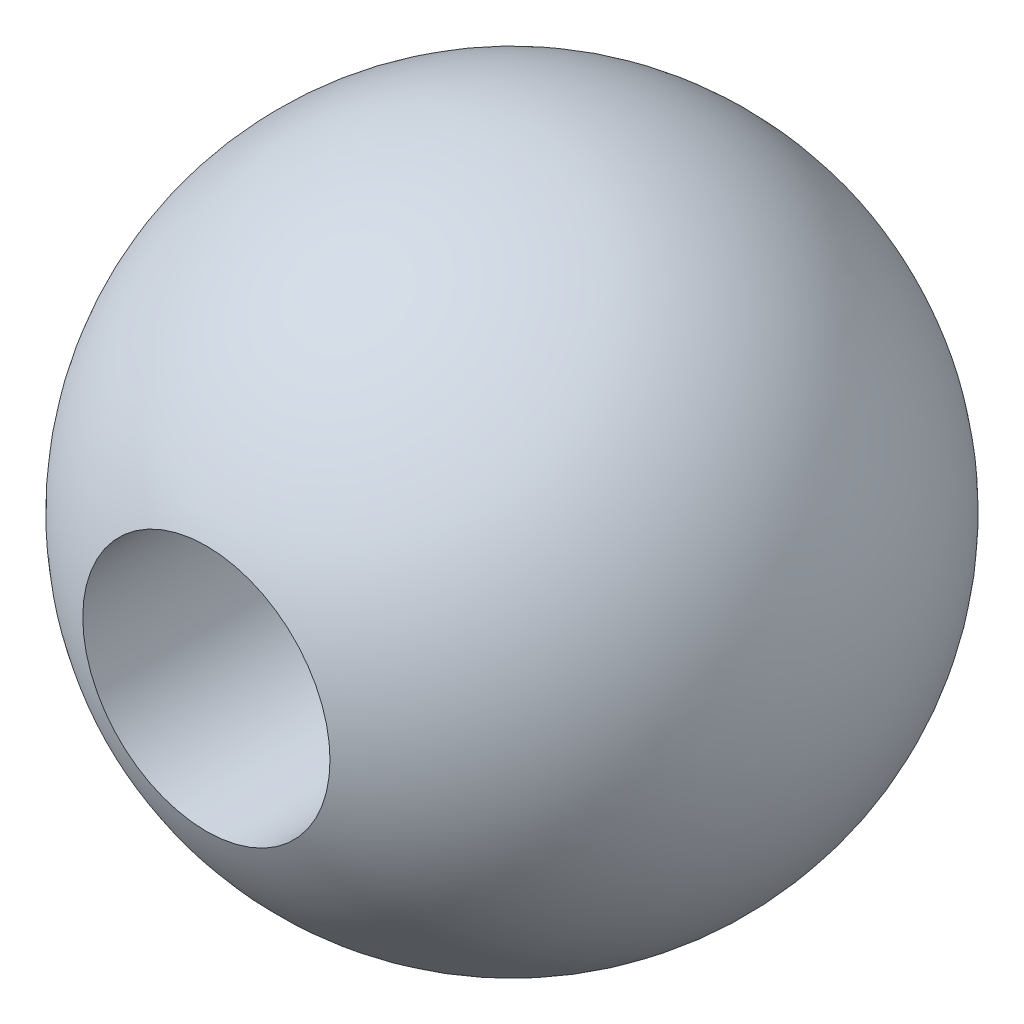
ISO-10303-21;
HEADER;
FILE_DESCRIPTION(('STEP AP214'),'2;1');
FILE_NAME('part.step','',(''),(''),'','','');
FILE_SCHEMA(('AUTOMOTIVE_DESIGN { 1 0 10303 214 1 1 1 1 }'));
ENDSEC;
DATA;
#1=APPLICATION_CONTEXT('core data for automotive mechanical design processes');
#2=APPLICATION_PROTOCOL_DEFINITION('international standard','automotive_design',2000,#1);
#3=PRODUCT_CONTEXT('',#1,'mechanical');
#4=PRODUCT('Part','Part','',(#3));
#5=PRODUCT_RELATED_PRODUCT_CATEGORY('part','',(#4));
#6=PRODUCT_DEFINITION_FORMATION('','',#4);
#7=PRODUCT_DEFINITION_CONTEXT('part definition',#1,'design');
#8=PRODUCT_DEFINITION('design','',#6,#7);
#9=PRODUCT_DEFINITION_SHAPE('','',#8);
#10=(LENGTH_UNIT() NAMED_UNIT(*) SI_UNIT(.MILLI.,.METRE.));
#11=(NAMED_UNIT(*) PLANE_ANGLE_UNIT() SI_UNIT($,.RADIAN.));
#12=(NAMED_UNIT(*) SI_UNIT($,.STERADIAN.) SOLID_ANGLE_UNIT());
#13=UNCERTAINTY_MEASURE_WITH_UNIT(LENGTH_MEASURE(1.E-05),#10,'distance_accuracy_value','');
#14=(GEOMETRIC_REPRESENTATION_CONTEXT(3) GLOBAL_UNCERTAINTY_ASSIGNED_CONTEXT((#13)) GLOBAL_UNIT_ASSIGNED_CONTEXT((#10,
#11,#12)) REPRESENTATION_CONTEXT('',''));
#15=CARTESIAN_POINT('',(0.,0.,0.));
#16=DIRECTION('',(0.,0.,1.));
#17=DIRECTION('',(1.,0.,0.));
#18=AXIS2_PLACEMENT_3D('',#15,#16,#17);
#19=CARTESIAN_POINT('',(0.,0.,0.));
#20=DIRECTION('',(0.,1.,0.));
#21=DIRECTION('',(1.,0.,0.));
#22=AXIS2_PLACEMENT_3D('',#19,#20,#21);
#23=SPHERICAL_SURFACE('',#22,25.4);
#24=CARTESIAN_POINT('',(0.,0.,0.));
#25=DIRECTION('',(0.,0.,-1.));
#26=DIRECTION('',(-1.,0.,0.));
#27=AXIS2_PLACEMENT_3D('',#24,#25,#26);
#28=SPHERICAL_SURFACE('',#27,25.4);
#29=CARTESIAN_POINT('',(0.,0.,23.5464301965287));
#30=DIRECTION('',(0.,0.,-1.));
#31=DIRECTION('',(-1.,0.,0.));
#32=AXIS2_PLACEMENT_3D('',#29,#30,#31);
#33=CIRCLE('',#32,9.525);
#34=CARTESIAN_POINT('',(9.525,0.,23.5464301965287));
#35=VERTEX_POINT('',#34);
#36=EDGE_CURVE('E10',#35,#35,#33,.T.);
#37=ORIENTED_EDGE('',*,*,#36,.T.);
#38=EDGE_LOOP('',(#37));
#39=FACE_BOUND('',#38,.T.);
#40=ADVANCED_FACE('F31',(#39),#28,.T.);
#41=CARTESIAN_POINT('',(0.,0.,6.35));
#42=DIRECTION('',(0.,0.,1.));
#43=DIRECTION('',(1.,0.,0.));
#44=AXIS2_PLACEMENT_3D('',#41,#42,#43);
#45=CYLINDRICAL_SURFACE('',#44,9.525);
#46=CARTESIAN_POINT('',(0.,0.,6.35));
#47=DIRECTION('',(0.,0.,1.));
#48=DIRECTION('',(1.,0.,0.));
#49=AXIS2_PLACEMENT_3D('',#46,#47,#48);
#50=CIRCLE('',#49,9.525);
#51=CARTESIAN_POINT('',(9.525,0.,6.35));
#52=VERTEX_POINT('',#51);
#53=EDGE_CURVE('E37',#52,#52,#50,.T.);
#54=CARTESIAN_POINT('',(9.525,0.,6.35));
#55=CARTESIAN_POINT('',(9.525,0.,6.52912948121384));
#56=CARTESIAN_POINT('',(9.525,0.,6.70825896242768));
#57=CARTESIAN_POINT('',(9.525,0.,7.06651792485536));
#58=CARTESIAN_POINT('',(9.525,0.,7.2456474060692));
#59=CARTESIAN_POINT('',(9.525,0.,7.60390636849688));
#60=CARTESIAN_POINT('',(9.525,0.,7.78303584971072));
#61=CARTESIAN_POINT('',(9.525,0.,8.14129481213841));
#62=CARTESIAN_POINT('',(9.525,0.,8.32042429335225));
#63=CARTESIAN_POINT('',(9.525,0.,8.67868325577993));
#64=CARTESIAN_POINT('',(9.525,0.,8.85781273699377));
#65=CARTESIAN_POINT('',(9.525,0.,9.21607169942145));
#66=CARTESIAN_POINT('',(9.525,0.,9.39520118063529));
#67=CARTESIAN_POINT('',(9.525,0.,9.75346014306298));
#68=CARTESIAN_POINT('',(9.525,0.,9.93258962427682));
#69=CARTESIAN_POINT('',(9.525,0.,10.2908485867045));
#70=CARTESIAN_POINT('',(9.525,0.,10.4699780679183));
#71=CARTESIAN_POINT('',(9.525,0.,10.828237030346));
#72=CARTESIAN_POINT('',(9.525,0.,11.0073665115599));
#73=CARTESIAN_POINT('',(9.525,0.,11.3656254739875));
#74=CARTESIAN_POINT('',(9.525,0.,11.5447549552014));
#75=CARTESIAN_POINT('',(9.525,0.,11.9030139176291));
#76=CARTESIAN_POINT('',(9.525,0.,12.0821433988429));
#77=CARTESIAN_POINT('',(9.525,0.,12.4404023612706));
#78=CARTESIAN_POINT('',(9.525,0.,12.6195318424844));
#79=CARTESIAN_POINT('',(9.525,0.,12.9777908049121));
#80=CARTESIAN_POINT('',(9.525,0.,13.156920286126));
#81=CARTESIAN_POINT('',(9.525,0.,13.5151792485536));
#82=CARTESIAN_POINT('',(9.525,0.,13.6943087297675));
#83=CARTESIAN_POINT('',(9.525,0.,14.0525676921952));
#84=CARTESIAN_POINT('',(9.525,0.,14.231697173409));
#85=CARTESIAN_POINT('',(9.525,0.,14.5899561358367));
#86=CARTESIAN_POINT('',(9.525,0.,14.7690856170505));
#87=CARTESIAN_POINT('',(9.525,0.,15.1273445794782));
#88=CARTESIAN_POINT('',(9.525,0.,15.306474060692));
#89=CARTESIAN_POINT('',(9.525,0.,15.6647330231197));
#90=CARTESIAN_POINT('',(9.525,0.,15.8438625043336));
#91=CARTESIAN_POINT('',(9.525,0.,16.2021214667612));
#92=CARTESIAN_POINT('',(9.525,0.,16.3812509479751));
#93=CARTESIAN_POINT('',(9.525,0.,16.7395099104028));
#94=CARTESIAN_POINT('',(9.525,0.,16.9186393916166));
#95=CARTESIAN_POINT('',(9.525,0.,17.2768983540443));
#96=CARTESIAN_POINT('',(9.525,0.,17.4560278352581));
#97=CARTESIAN_POINT('',(9.525,0.,17.8142867976858));
#98=CARTESIAN_POINT('',(9.525,0.,17.9934162788997));
#99=CARTESIAN_POINT('',(9.525,0.,18.3516752413273));
#100=CARTESIAN_POINT('',(9.525,0.,18.5308047225412));
#101=CARTESIAN_POINT('',(9.525,0.,18.8890636849689));
#102=CARTESIAN_POINT('',(9.525,0.,19.0681931661827));
#103=CARTESIAN_POINT('',(9.525,0.,19.4264521286104));
#104=CARTESIAN_POINT('',(9.525,0.,19.6055816098242));
#105=CARTESIAN_POINT('',(9.525,0.,19.9638405722519));
#106=CARTESIAN_POINT('',(9.525,0.,20.1429700534657));
#107=CARTESIAN_POINT('',(9.525,0.,20.5012290158934));
#108=CARTESIAN_POINT('',(9.525,0.,20.6803584971073));
#109=CARTESIAN_POINT('',(9.525,0.,21.038617459535));
#110=CARTESIAN_POINT('',(9.525,0.,21.2177469407488));
#111=CARTESIAN_POINT('',(9.525,0.,21.5760059031765));
#112=CARTESIAN_POINT('',(9.525,0.,21.7551353843903));
#113=CARTESIAN_POINT('',(9.525,0.,22.113394346818));
#114=CARTESIAN_POINT('',(9.525,0.,22.2925238280318));
#115=CARTESIAN_POINT('',(9.525,0.,22.6507827904595));
#116=CARTESIAN_POINT('',(9.525,0.,22.8299122716734));
#117=CARTESIAN_POINT('',(9.525,0.,23.188171234101));
#118=CARTESIAN_POINT('',(9.525,0.,23.3673007153149));
#119=CARTESIAN_POINT('',(9.525,0.,23.5464301965287));
#120=B_SPLINE_CURVE_WITH_KNOTS('',3,(#54,#55,#56,#57,#58,#59,#60,#61,#62,#63,#64,#65,#66,#67,
#68,#69,#70,#71,#72,#73,#74,#75,#76,#77,#78,#79,#80,#81,#82,#83,#84,#85,#86,#87,#88,#89,#90,#91,
#92,#93,#94,#95,#96,#97,#98,#99,#100,#101,#102,#103,#104,#105,#106,#107,#108,#109,#110,#111,
#112,#113,#114,#115,#116,#117,#118,#119),.UNSPECIFIED.,.F.,.F.,(4,2,2,2,2,2,2,2,2,2,2,2,2,2,2,2,
2,2,2,2,2,2,2,2,2,2,2,2,2,2,2,2,4),(0.,0.537388443641523,1.07477688728305,1.61216533092457,
2.14955377456609,2.68694221820761,3.22433066184914,3.76171910549066,4.29910754913218,
4.8364959927737,5.37388443641523,5.91127288005675,6.44866132369827,6.9860497673398,
7.52343821098132,8.06082665462284,8.59821509826436,9.13560354190589,9.67299198554741,
10.2103804291889,10.7477688728305,11.285157316472,11.8225457601135,12.359934203755,
12.8973226473965,13.4347110910381,13.9720995346796,14.5094879783211,15.0468764219626,
15.5842648656042,16.1216533092457,16.6590417528872,17.1964301965287),.UNSPECIFIED.);
#121=EDGE_CURVE('BSEAM45',#52,#35,#120,.T.);
#122=ORIENTED_EDGE('',*,*,#53,.F.);
#123=ORIENTED_EDGE('',*,*,#36,.F.);
#124=ORIENTED_EDGE('',*,*,#121,.T.);
#125=ORIENTED_EDGE('',*,*,#121,.F.);
#126=EDGE_LOOP('',(#122,#124,#123,#125));
#127=FACE_BOUND('',#126,.T.);
#128=ADVANCED_FACE('F45',(#127),#45,.F.);
#129=CARTESIAN_POINT('',(0.,0.,6.35));
#130=DIRECTION('',(0.,0.,1.));
#131=DIRECTION('',(1.,0.,0.));
#132=AXIS2_PLACEMENT_3D('',#129,#130,#131);
#133=PLANE('',#132);
#134=ORIENTED_EDGE('',*,*,#53,.T.);
#135=EDGE_LOOP('',(#134));
#136=FACE_BOUND('',#135,.T.);
#137=ADVANCED_FACE('F43',(#136),#133,.T.);
#138=CLOSED_SHELL('',(#40,#128,#137));
#139=MANIFOLD_SOLID_BREP('B2',#138);
#140=ADVANCED_BREP_SHAPE_REPRESENTATION('',(#18,#139),#14);
#141=SHAPE_DEFINITION_REPRESENTATION(#9,#140);
ENDSEC;
END-ISO-10303-21;
